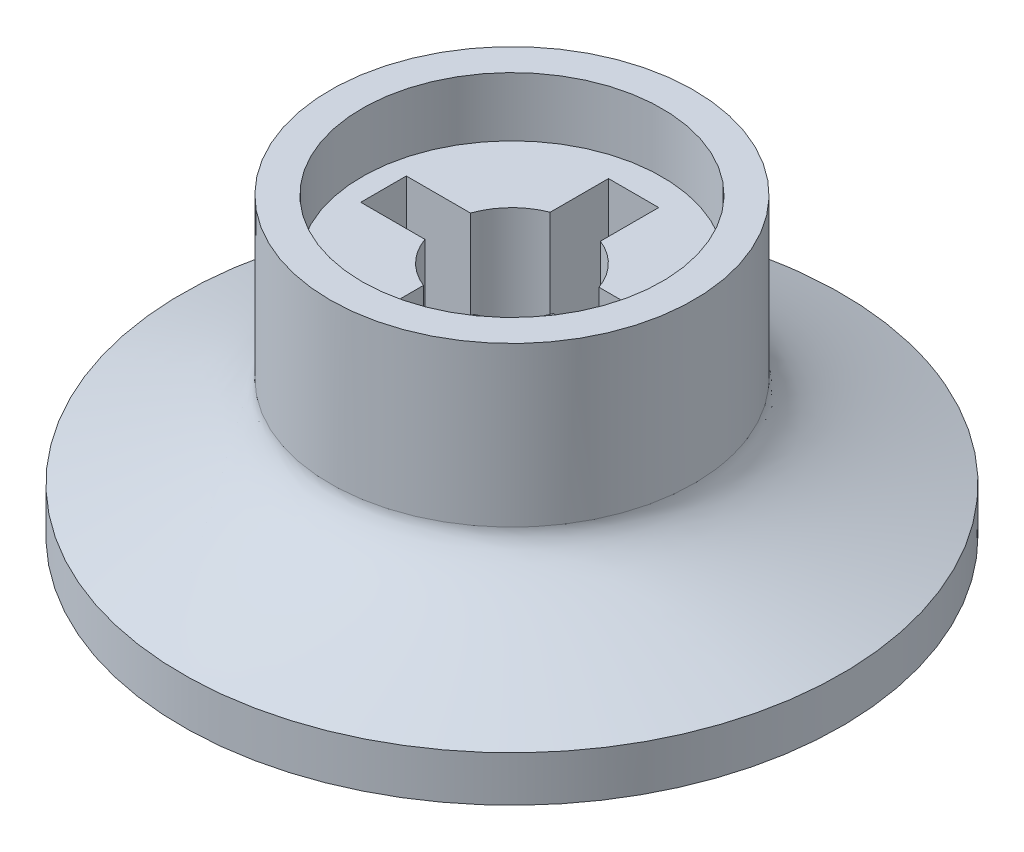
ISO-10303-21;
HEADER;
FILE_DESCRIPTION(('STEP AP214'),'2;1');
FILE_NAME('part.step','',(''),(''),'','','');
FILE_SCHEMA(('AUTOMOTIVE_DESIGN { 1 0 10303 214 1 1 1 1 }'));
ENDSEC;
DATA;
#1=APPLICATION_CONTEXT('core data for automotive mechanical design processes');
#2=APPLICATION_PROTOCOL_DEFINITION('international standard','automotive_design',2000,#1);
#3=PRODUCT_CONTEXT('',#1,'mechanical');
#4=PRODUCT('Part','Part','',(#3));
#5=PRODUCT_RELATED_PRODUCT_CATEGORY('part','',(#4));
#6=PRODUCT_DEFINITION_FORMATION('','',#4);
#7=PRODUCT_DEFINITION_CONTEXT('part definition',#1,'design');
#8=PRODUCT_DEFINITION('design','',#6,#7);
#9=PRODUCT_DEFINITION_SHAPE('','',#8);
#10=(LENGTH_UNIT() NAMED_UNIT(*) SI_UNIT(.MILLI.,.METRE.));
#11=(NAMED_UNIT(*) PLANE_ANGLE_UNIT() SI_UNIT($,.RADIAN.));
#12=(NAMED_UNIT(*) SI_UNIT($,.STERADIAN.) SOLID_ANGLE_UNIT());
#13=UNCERTAINTY_MEASURE_WITH_UNIT(LENGTH_MEASURE(1.E-05),#10,'distance_accuracy_value','');
#14=(GEOMETRIC_REPRESENTATION_CONTEXT(3) GLOBAL_UNCERTAINTY_ASSIGNED_CONTEXT((#13)) GLOBAL_UNIT_ASSIGNED_CONTEXT((#10,
#11,#12)) REPRESENTATION_CONTEXT('',''));
#15=CARTESIAN_POINT('',(0.,0.,0.));
#16=DIRECTION('',(0.,0.,1.));
#17=DIRECTION('',(1.,0.,0.));
#18=AXIS2_PLACEMENT_3D('',#15,#16,#17);
#19=CARTESIAN_POINT('',(0.,3.5,0.));
#20=DIRECTION('',(0.,-1.,0.));
#21=DIRECTION('',(0.,0.,-1.));
#22=AXIS2_PLACEMENT_3D('',#19,#20,#21);
#23=CYLINDRICAL_SURFACE('',#22,4.);
#24=CARTESIAN_POINT('',(0.,3.5,0.));
#25=DIRECTION('',(0.,1.,0.));
#26=DIRECTION('',(0.,0.,1.));
#27=AXIS2_PLACEMENT_3D('',#24,#25,#26);
#28=CIRCLE('',#27,4.);
#29=CARTESIAN_POINT('',(0.,3.5,4.));
#30=VERTEX_POINT('',#29);
#31=EDGE_CURVE('E47',#30,#30,#28,.T.);
#32=ORIENTED_EDGE('',*,*,#31,.F.);
#33=EDGE_LOOP('',(#32));
#34=FACE_BOUND('',#33,.T.);
#35=CARTESIAN_POINT('',(0.,0.,0.));
#36=DIRECTION('',(0.,1.,0.));
#37=DIRECTION('',(0.,0.,1.));
#38=AXIS2_PLACEMENT_3D('',#35,#36,#37);
#39=CIRCLE('',#38,4.);
#40=CARTESIAN_POINT('',(-3.41841549567665,0.,2.07712192682996));
#41=VERTEX_POINT('',#40);
#42=EDGE_CURVE('E199',#41,#41,#39,.T.);
#43=ORIENTED_EDGE('',*,*,#42,.T.);
#44=EDGE_LOOP('',(#43));
#45=FACE_BOUND('',#44,.T.);
#46=ADVANCED_FACE('F40',(#34,#45),#23,.T.);
#47=CARTESIAN_POINT('',(0.,3.5,0.));
#48=DIRECTION('',(0.,1.,0.));
#49=DIRECTION('',(0.,0.,1.));
#50=AXIS2_PLACEMENT_3D('',#47,#48,#49);
#51=PLANE('',#50);
#52=CARTESIAN_POINT('',(0.,3.5,0.));
#53=DIRECTION('',(0.,1.,0.));
#54=DIRECTION('',(0.,0.,1.));
#55=AXIS2_PLACEMENT_3D('',#52,#53,#54);
#56=CIRCLE('',#55,3.3);
#57=CARTESIAN_POINT('',(0.,3.5,3.3));
#58=VERTEX_POINT('',#57);
#59=EDGE_CURVE('E246',#58,#58,#56,.T.);
#60=ORIENTED_EDGE('',*,*,#59,.F.);
#61=EDGE_LOOP('',(#60));
#62=FACE_BOUND('',#61,.T.);
#63=ORIENTED_EDGE('',*,*,#31,.T.);
#64=EDGE_LOOP('',(#63));
#65=FACE_BOUND('',#64,.T.);
#66=ADVANCED_FACE('F235',(#62,#65),#51,.T.);
#67=CARTESIAN_POINT('',(0.,2.2,0.));
#68=DIRECTION('',(0.,1.,0.));
#69=DIRECTION('',(0.,0.,1.));
#70=AXIS2_PLACEMENT_3D('',#67,#68,#69);
#71=CYLINDRICAL_SURFACE('',#70,3.3);
#72=CARTESIAN_POINT('',(0.,2.2,0.));
#73=DIRECTION('',(0.,1.,0.));
#74=DIRECTION('',(0.,0.,1.));
#75=AXIS2_PLACEMENT_3D('',#72,#73,#74);
#76=CIRCLE('',#75,3.3);
#77=CARTESIAN_POINT('',(0.,2.2,3.3));
#78=VERTEX_POINT('',#77);
#79=EDGE_CURVE('E249',#78,#78,#76,.T.);
#80=ORIENTED_EDGE('',*,*,#79,.F.);
#81=EDGE_LOOP('',(#80));
#82=FACE_BOUND('',#81,.T.);
#83=ORIENTED_EDGE('',*,*,#59,.T.);
#84=EDGE_LOOP('',(#83));
#85=FACE_BOUND('',#84,.T.);
#86=ADVANCED_FACE('F233',(#82,#85),#71,.F.);
#87=CARTESIAN_POINT('',(0.,2.2,0.));
#88=DIRECTION('',(0.,1.,0.));
#89=DIRECTION('',(0.,0.,1.));
#90=AXIS2_PLACEMENT_3D('',#87,#88,#89);
#91=PLANE('',#90);
#92=CARTESIAN_POINT('',(0.,2.2,0.));
#93=DIRECTION('',(0.,1.,0.));
#94=DIRECTION('',(0.,0.,1.));
#95=AXIS2_PLACEMENT_3D('',#92,#93,#94);
#96=CIRCLE('',#95,1.5);
#97=CARTESIAN_POINT('',(0.552263358297722,2.2,1.39463442632172));
#98=VERTEX_POINT('',#97);
#99=CARTESIAN_POINT('',(1.41380435039056,2.2,0.501155922659535));
#100=VERTEX_POINT('',#99);
#101=EDGE_CURVE('E152',#98,#100,#96,.T.);
#102=ORIENTED_EDGE('',*,*,#101,.F.);
#103=DIRECTION('',(0.,0.,-1.));
#104=VECTOR('',#103,1.);
#105=CARTESIAN_POINT('',(0.552263358297722,2.2,0.));
#106=LINE('',#105,#104);
#107=CARTESIAN_POINT('',(0.552263358297722,2.2,2.76136202651855));
#108=VERTEX_POINT('',#107);
#109=EDGE_CURVE('E167',#108,#98,#106,.T.);
#110=ORIENTED_EDGE('',*,*,#109,.F.);
#111=DIRECTION('',(1.,0.,0.));
#112=VECTOR('',#111,1.);
#113=CARTESIAN_POINT('',(0.,2.2,2.76136202651855));
#114=LINE('',#113,#112);
#115=CARTESIAN_POINT('',(-0.552263358297722,2.2,2.76136202651855));
#116=VERTEX_POINT('',#115);
#117=EDGE_CURVE('E177',#116,#108,#114,.T.);
#118=ORIENTED_EDGE('',*,*,#117,.F.);
#119=DIRECTION('',(0.,0.,1.));
#120=VECTOR('',#119,1.);
#121=CARTESIAN_POINT('',(-0.552263358297722,2.2,0.));
#122=LINE('',#121,#120);
#123=CARTESIAN_POINT('',(-0.552263358297722,2.2,1.39463442632172));
#124=VERTEX_POINT('',#123);
#125=EDGE_CURVE('E181',#124,#116,#122,.T.);
#126=ORIENTED_EDGE('',*,*,#125,.F.);
#127=CARTESIAN_POINT('',(-1.41380435039056,2.2,0.501155922659535));
#128=VERTEX_POINT('',#127);
#129=EDGE_CURVE('E173',#128,#124,#96,.T.);
#130=ORIENTED_EDGE('',*,*,#129,.F.);
#131=DIRECTION('',(1.,0.,0.));
#132=VECTOR('',#131,1.);
#133=CARTESIAN_POINT('',(0.,2.2,0.501155922659535));
#134=LINE('',#133,#132);
#135=CARTESIAN_POINT('',(-2.82555946794005,2.2,0.501155922659535));
#136=VERTEX_POINT('',#135);
#137=EDGE_CURVE('E485',#136,#128,#134,.T.);
#138=ORIENTED_EDGE('',*,*,#137,.F.);
#139=DIRECTION('',(0.,0.,1.));
#140=VECTOR('',#139,1.);
#141=CARTESIAN_POINT('',(-2.82555946794005,2.2,0.));
#142=LINE('',#141,#140);
#143=CARTESIAN_POINT('',(-2.82555946794005,2.2,-0.501155922659535));
#144=VERTEX_POINT('',#143);
#145=EDGE_CURVE('E482',#144,#136,#142,.T.);
#146=ORIENTED_EDGE('',*,*,#145,.F.);
#147=DIRECTION('',(-1.,0.,0.));
#148=VECTOR('',#147,1.);
#149=CARTESIAN_POINT('',(0.,2.2,-0.501155922659535));
#150=LINE('',#149,#148);
#151=CARTESIAN_POINT('',(-1.41380435039056,2.2,-0.501155922659535));
#152=VERTEX_POINT('',#151);
#153=EDGE_CURVE('E477',#152,#144,#150,.T.);
#154=ORIENTED_EDGE('',*,*,#153,.F.);
#155=CARTESIAN_POINT('',(-0.552263358297722,2.2,-1.39463442632172));
#156=VERTEX_POINT('',#155);
#157=EDGE_CURVE('E469',#156,#152,#96,.T.);
#158=ORIENTED_EDGE('',*,*,#157,.F.);
#159=DIRECTION('',(0.,0.,1.));
#160=VECTOR('',#159,1.);
#161=CARTESIAN_POINT('',(-0.552263358297722,2.2,0.));
#162=LINE('',#161,#160);
#163=CARTESIAN_POINT('',(-0.552263358297722,2.2,-2.67606994836456));
#164=VERTEX_POINT('',#163);
#165=EDGE_CURVE('E193',#164,#156,#162,.T.);
#166=ORIENTED_EDGE('',*,*,#165,.F.);
#167=DIRECTION('',(-1.,0.,0.));
#168=VECTOR('',#167,1.);
#169=CARTESIAN_POINT('',(0.,2.2,-2.67606994836456));
#170=LINE('',#169,#168);
#171=CARTESIAN_POINT('',(0.552263358297722,2.2,-2.67606994836456));
#172=VERTEX_POINT('',#171);
#173=EDGE_CURVE('E191',#172,#164,#170,.T.);
#174=ORIENTED_EDGE('',*,*,#173,.F.);
#175=DIRECTION('',(0.,0.,-1.));
#176=VECTOR('',#175,1.);
#177=CARTESIAN_POINT('',(0.552263358297722,2.2,0.));
#178=LINE('',#177,#176);
#179=CARTESIAN_POINT('',(0.552263358297722,2.2,-1.39463442632172));
#180=VERTEX_POINT('',#179);
#181=EDGE_CURVE('E189',#180,#172,#178,.T.);
#182=ORIENTED_EDGE('',*,*,#181,.F.);
#183=CARTESIAN_POINT('',(1.41380435039056,2.2,-0.501155922659535));
#184=VERTEX_POINT('',#183);
#185=EDGE_CURVE('E171',#184,#180,#96,.T.);
#186=ORIENTED_EDGE('',*,*,#185,.F.);
#187=DIRECTION('',(-1.,0.,0.));
#188=VECTOR('',#187,1.);
#189=CARTESIAN_POINT('',(0.,2.2,-0.501155922659535));
#190=LINE('',#189,#188);
#191=CARTESIAN_POINT('',(2.7646847157996,2.2,-0.501155922659535));
#192=VERTEX_POINT('',#191);
#193=EDGE_CURVE('E186',#192,#184,#190,.T.);
#194=ORIENTED_EDGE('',*,*,#193,.F.);
#195=DIRECTION('',(0.,0.,-1.));
#196=VECTOR('',#195,1.);
#197=CARTESIAN_POINT('',(2.7646847157996,2.2,0.));
#198=LINE('',#197,#196);
#199=CARTESIAN_POINT('',(2.7646847157996,2.2,0.501155922659535));
#200=VERTEX_POINT('',#199);
#201=EDGE_CURVE('E179',#200,#192,#198,.T.);
#202=ORIENTED_EDGE('',*,*,#201,.F.);
#203=DIRECTION('',(1.,0.,0.));
#204=VECTOR('',#203,1.);
#205=CARTESIAN_POINT('',(0.,2.2,0.501155922659535));
#206=LINE('',#205,#204);
#207=EDGE_CURVE('E169',#100,#200,#206,.T.);
#208=ORIENTED_EDGE('',*,*,#207,.F.);
#209=EDGE_LOOP('',(#102,#110,#118,#126,#130,#138,#146,#154,#158,#166,#174,#182,#186,#194,#202,#208));
#210=FACE_BOUND('',#209,.T.);
#211=ORIENTED_EDGE('',*,*,#79,.T.);
#212=EDGE_LOOP('',(#211));
#213=FACE_BOUND('',#212,.T.);
#214=ADVANCED_FACE('F164',(#210,#213),#91,.T.);
#215=CARTESIAN_POINT('',(-3.41841549567665,0.,2.07712192682996));
#216=CARTESIAN_POINT('',(-0.432497455078735,-2.,7.23708822326704));
#217=CARTESIAN_POINT('',(-7.57265934933656,0.,-4.75970906452334));
#218=CARTESIAN_POINT('',(-14.9066739016128,-2.,6.37209331310957));
#219=CARTESIAN_POINT('',(-0.735828357983266,0.,-8.91395291818325));
#220=CARTESIAN_POINT('',(-14.0416789914553,-2.,-8.10208313342451));
#221=CARTESIAN_POINT('',(3.41841549567665,0.,-2.07712192682996));
#222=CARTESIAN_POINT('',(0.432497455078736,-2.,-7.23708822326704));
#223=CARTESIAN_POINT('',(7.57265934933656,0.,4.75970906452334));
#224=CARTESIAN_POINT('',(14.9066739016128,-2.,-6.37209331310956));
#225=CARTESIAN_POINT('',(0.735828357983265,0.,8.91395291818325));
#226=CARTESIAN_POINT('',(14.0416789914553,-2.,8.10208313342451));
#227=CARTESIAN_POINT('',(-3.41841549567665,0.,2.07712192682996));
#228=CARTESIAN_POINT('',(-0.432497455078735,-2.,7.23708822326704));
#229=(BOUNDED_SURFACE() B_SPLINE_SURFACE(3,1,((#215,#216),(#217,#218),(#219,#220),(#221,#222),
(#223,#224),(#225,#226),(#227,#228)),.UNSPECIFIED.,.T.,.F.,.F.) B_SPLINE_SURFACE_WITH_KNOTS((4,
3,4),(2,2),(0.,0.5,1.),(0.,1.),
.UNSPECIFIED.) GEOMETRIC_REPRESENTATION_ITEM() RATIONAL_B_SPLINE_SURFACE(((1.,1.),
(0.333333333333333,0.333333333333333),(0.333333333333333,0.333333333333333),(1.,1.),
(0.333333333333333,0.333333333333333),(0.333333333333333,0.333333333333333),(1.,1.))) REPRESENTATION_ITEM('') SURFACE());
#230=CARTESIAN_POINT('',(0.,-2.,0.));
#231=DIRECTION('',(0.,-1.,0.));
#232=DIRECTION('',(0.,0.,-1.));
#233=AXIS2_PLACEMENT_3D('',#230,#231,#232);
#234=CIRCLE('',#233,7.25);
#235=CARTESIAN_POINT('',(-0.432497455078735,-2.,7.23708822326704));
#236=VERTEX_POINT('',#235);
#237=EDGE_CURVE('E204',#236,#236,#234,.T.);
#238=CARTESIAN_POINT('',(-3.41841549567665,0.,2.07712192682996));
#239=CARTESIAN_POINT('',(-3.38731218275375,-0.0208333333333334,2.13087157575118));
#240=CARTESIAN_POINT('',(-3.35620886983086,-0.0416666666666667,2.18462122467239));
#241=CARTESIAN_POINT('',(-3.29400224398507,-0.0833333333333333,2.29212052251483));
#242=CARTESIAN_POINT('',(-3.26289893106217,-0.104166666666667,2.34587017143605));
#243=CARTESIAN_POINT('',(-3.20069230521638,-0.145833333333333,2.45336946927849));
#244=CARTESIAN_POINT('',(-3.16958899229349,-0.166666666666667,2.50711911819971));
#245=CARTESIAN_POINT('',(-3.1073823664477,-0.208333333333333,2.61461841604215));
#246=CARTESIAN_POINT('',(-3.0762790535248,-0.229166666666667,2.66836806496337));
#247=CARTESIAN_POINT('',(-3.01407242767901,-0.270833333333333,2.77586736280581));
#248=CARTESIAN_POINT('',(-2.98296911475612,-0.291666666666667,2.82961701172703));
#249=CARTESIAN_POINT('',(-2.92076248891033,-0.333333333333333,2.93711630956947));
#250=CARTESIAN_POINT('',(-2.88965917598743,-0.354166666666667,2.99086595849069));
#251=CARTESIAN_POINT('',(-2.82745255014164,-0.395833333333333,3.09836525633313));
#252=CARTESIAN_POINT('',(-2.79634923721875,-0.416666666666667,3.15211490525435));
#253=CARTESIAN_POINT('',(-2.73414261137296,-0.458333333333333,3.25961420309679));
#254=CARTESIAN_POINT('',(-2.70303929845006,-0.479166666666667,3.31336385201801));
#255=CARTESIAN_POINT('',(-2.64083267260427,-0.520833333333333,3.42086314986045));
#256=CARTESIAN_POINT('',(-2.60972935968138,-0.541666666666667,3.47461279878167));
#257=CARTESIAN_POINT('',(-2.54752273383559,-0.583333333333333,3.5821120966241));
#258=CARTESIAN_POINT('',(-2.51641942091269,-0.604166666666667,3.63586174554532));
#259=CARTESIAN_POINT('',(-2.4542127950669,-0.645833333333333,3.74336104338776));
#260=CARTESIAN_POINT('',(-2.42310948214401,-0.666666666666667,3.79711069230898));
#261=CARTESIAN_POINT('',(-2.36090285629822,-0.708333333333333,3.90460999015142));
#262=CARTESIAN_POINT('',(-2.32979954337532,-0.729166666666667,3.95835963907264));
#263=CARTESIAN_POINT('',(-2.26759291752954,-0.770833333333333,4.06585893691508));
#264=CARTESIAN_POINT('',(-2.23648960460664,-0.791666666666667,4.1196085858363));
#265=CARTESIAN_POINT('',(-2.17428297876085,-0.833333333333333,4.22710788367874));
#266=CARTESIAN_POINT('',(-2.14317966583796,-0.854166666666667,4.28085753259996));
#267=CARTESIAN_POINT('',(-2.08097303999217,-0.895833333333333,4.3883568304424));
#268=CARTESIAN_POINT('',(-2.04986972706927,-0.916666666666667,4.44210647936362));
#269=CARTESIAN_POINT('',(-1.98766310122348,-0.958333333333333,4.54960577720606));
#270=CARTESIAN_POINT('',(-1.95655978830059,-0.979166666666667,4.60335542612728));
#271=CARTESIAN_POINT('',(-1.8943531624548,-1.02083333333333,4.71085472396972));
#272=CARTESIAN_POINT('',(-1.8632498495319,-1.04166666666667,4.76460437289094));
#273=CARTESIAN_POINT('',(-1.80104322368611,-1.08333333333333,4.87210367073337));
#274=CARTESIAN_POINT('',(-1.76993991076322,-1.10416666666667,4.92585331965459));
#275=CARTESIAN_POINT('',(-1.70773328491743,-1.14583333333333,5.03335261749703));
#276=CARTESIAN_POINT('',(-1.67662997199453,-1.16666666666667,5.08710226641825));
#277=CARTESIAN_POINT('',(-1.61442334614874,-1.20833333333333,5.19460156426069));
#278=CARTESIAN_POINT('',(-1.58332003322585,-1.22916666666667,5.24835121318191));
#279=CARTESIAN_POINT('',(-1.52111340738006,-1.27083333333333,5.35585051102435));
#280=CARTESIAN_POINT('',(-1.49001009445716,-1.29166666666667,5.40960015994557));
#281=CARTESIAN_POINT('',(-1.42780346861137,-1.33333333333333,5.51709945778801));
#282=CARTESIAN_POINT('',(-1.39670015568848,-1.35416666666667,5.57084910670923));
#283=CARTESIAN_POINT('',(-1.33449352984269,-1.39583333333333,5.67834840455167));
#284=CARTESIAN_POINT('',(-1.30339021691979,-1.41666666666667,5.73209805347289));
#285=CARTESIAN_POINT('',(-1.241183591074,-1.45833333333333,5.83959735131533));
#286=CARTESIAN_POINT('',(-1.21008027815111,-1.47916666666667,5.89334700023655));
#287=CARTESIAN_POINT('',(-1.14787365230532,-1.52083333333333,6.00084629807899));
#288=CARTESIAN_POINT('',(-1.11677033938242,-1.54166666666667,6.05459594700021));
#289=CARTESIAN_POINT('',(-1.05456371353663,-1.58333333333333,6.16209524484264));
#290=CARTESIAN_POINT('',(-1.02346040061374,-1.60416666666667,6.21584489376386));
#291=CARTESIAN_POINT('',(-0.961253774767949,-1.64583333333333,6.3233441916063));
#292=CARTESIAN_POINT('',(-0.930150461845054,-1.66666666666667,6.37709384052752));
#293=CARTESIAN_POINT('',(-0.867943835999264,-1.70833333333333,6.48459313836996));
#294=CARTESIAN_POINT('',(-0.836840523076369,-1.72916666666667,6.53834278729118));
#295=CARTESIAN_POINT('',(-0.77463389723058,-1.77083333333333,6.64584208513362));
#296=CARTESIAN_POINT('',(-0.743530584307685,-1.79166666666667,6.69959173405484));
#297=CARTESIAN_POINT('',(-0.681323958461895,-1.83333333333333,6.80709103189728));
#298=CARTESIAN_POINT('',(-0.650220645539,-1.85416666666667,6.8608406808185));
#299=CARTESIAN_POINT('',(-0.58801401969321,-1.89583333333333,6.96833997866094));
#300=CARTESIAN_POINT('',(-0.556910706770315,-1.91666666666667,7.02208962758216));
#301=CARTESIAN_POINT('',(-0.494704080924525,-1.95833333333333,7.1295889254246));
#302=CARTESIAN_POINT('',(-0.46360076800163,-1.97916666666667,7.18333857434582));
#303=CARTESIAN_POINT('',(-0.432497455078735,-2.,7.23708822326704));
#304=B_SPLINE_CURVE_WITH_KNOTS('',3,(#238,#239,#240,#241,#242,#243,#244,#245,#246,#247,#248,
#249,#250,#251,#252,#253,#254,#255,#256,#257,#258,#259,#260,#261,#262,#263,#264,#265,#266,#267,
#268,#269,#270,#271,#272,#273,#274,#275,#276,#277,#278,#279,#280,#281,#282,#283,#284,#285,#286,
#287,#288,#289,#290,#291,#292,#293,#294,#295,#296,#297,#298,#299,#300,#301,#302,#303),
.UNSPECIFIED.,.F.,.F.,(4,2,2,2,2,2,2,2,2,2,2,2,2,2,2,2,2,2,2,2,2,2,2,2,2,2,2,2,2,2,2,2,4),(0.,
0.196505006311302,0.393010012622605,0.589515018933907,0.786020025245209,0.982525031556511,
1.17903003786781,1.37553504417912,1.57204005049042,1.76854505680172,1.96505006311302,
2.16155506942433,2.35806007573563,2.55456508204693,2.75107008835823,2.94757509466953,
3.14408010098084,3.34058510729214,3.53709011360344,3.73359511991474,3.93010012622605,
4.12660513253735,4.32311013884865,4.51961514515995,4.71612015147126,4.91262515778256,
5.10913016409386,5.30563517040516,5.50214017671647,5.69864518302777,5.89515018933907,
6.09165519565037,6.28816020196167),.UNSPECIFIED.);
#305=EDGE_CURVE('BSEAM210',#41,#236,#304,.T.);
#306=ORIENTED_EDGE('',*,*,#42,.F.);
#307=ORIENTED_EDGE('',*,*,#237,.F.);
#308=ORIENTED_EDGE('',*,*,#305,.T.);
#309=ORIENTED_EDGE('',*,*,#305,.F.);
#310=EDGE_LOOP('',(#306,#308,#307,#309));
#311=FACE_BOUND('',#310,.T.);
#312=ADVANCED_FACE('F210',(#311),#229,.T.);
#313=CARTESIAN_POINT('',(0.,-3.,0.));
#314=DIRECTION('',(0.,1.,0.));
#315=DIRECTION('',(0.,0.,1.));
#316=AXIS2_PLACEMENT_3D('',#313,#314,#315);
#317=CYLINDRICAL_SURFACE('',#316,7.25);
#318=CARTESIAN_POINT('',(0.,-3.,0.));
#319=DIRECTION('',(0.,-1.,0.));
#320=DIRECTION('',(0.,0.,-1.));
#321=AXIS2_PLACEMENT_3D('',#318,#319,#320);
#322=CIRCLE('',#321,7.25);
#323=CARTESIAN_POINT('',(0.,-3.,-7.25));
#324=VERTEX_POINT('',#323);
#325=EDGE_CURVE('E196',#324,#324,#322,.T.);
#326=ORIENTED_EDGE('',*,*,#325,.F.);
#327=EDGE_LOOP('',(#326));
#328=FACE_BOUND('',#327,.T.);
#329=ORIENTED_EDGE('',*,*,#237,.T.);
#330=EDGE_LOOP('',(#329));
#331=FACE_BOUND('',#330,.T.);
#332=ADVANCED_FACE('F222',(#328,#331),#317,.T.);
#333=CARTESIAN_POINT('',(0.,-3.,0.));
#334=DIRECTION('',(0.,-1.,0.));
#335=DIRECTION('',(0.,0.,-1.));
#336=AXIS2_PLACEMENT_3D('',#333,#334,#335);
#337=PLANE('',#336);
#338=CARTESIAN_POINT('',(0.,-3.,0.));
#339=DIRECTION('',(0.,1.,0.));
#340=DIRECTION('',(0.,0.,1.));
#341=AXIS2_PLACEMENT_3D('',#338,#339,#340);
#342=CIRCLE('',#341,1.5);
#343=CARTESIAN_POINT('',(1.41380435039056,-3.,-0.501155922659535));
#344=VERTEX_POINT('',#343);
#345=CARTESIAN_POINT('',(0.552263358297722,-3.,-1.39463442632172));
#346=VERTEX_POINT('',#345);
#347=EDGE_CURVE('E54',#344,#346,#342,.T.);
#348=ORIENTED_EDGE('',*,*,#347,.T.);
#349=DIRECTION('',(0.,0.,-1.));
#350=VECTOR('',#349,1.);
#351=CARTESIAN_POINT('',(0.552263358297722,-3.,-2.67606994836456));
#352=LINE('',#351,#350);
#353=CARTESIAN_POINT('',(0.552263358297722,-3.,-2.67606994836456));
#354=VERTEX_POINT('',#353);
#355=EDGE_CURVE('E521',#346,#354,#352,.T.);
#356=ORIENTED_EDGE('',*,*,#355,.T.);
#357=DIRECTION('',(-1.,0.,0.));
#358=VECTOR('',#357,1.);
#359=CARTESIAN_POINT('',(-0.552263358297722,-3.,-2.67606994836456));
#360=LINE('',#359,#358);
#361=CARTESIAN_POINT('',(-0.552263358297722,-3.,-2.67606994836456));
#362=VERTEX_POINT('',#361);
#363=EDGE_CURVE('E518',#354,#362,#360,.T.);
#364=ORIENTED_EDGE('',*,*,#363,.T.);
#365=DIRECTION('',(0.,0.,1.));
#366=VECTOR('',#365,1.);
#367=CARTESIAN_POINT('',(-0.552263358297722,-3.,-0.501155922659535));
#368=LINE('',#367,#366);
#369=CARTESIAN_POINT('',(-0.552263358297722,-3.,-1.39463442632172));
#370=VERTEX_POINT('',#369);
#371=EDGE_CURVE('E543',#362,#370,#368,.T.);
#372=ORIENTED_EDGE('',*,*,#371,.T.);
#373=CARTESIAN_POINT('',(-1.41380435039056,-3.,-0.501155922659535));
#374=VERTEX_POINT('',#373);
#375=EDGE_CURVE('E558',#370,#374,#342,.T.);
#376=ORIENTED_EDGE('',*,*,#375,.T.);
#377=DIRECTION('',(-1.,0.,0.));
#378=VECTOR('',#377,1.);
#379=CARTESIAN_POINT('',(-2.82555946794005,-3.,-0.501155922659535));
#380=LINE('',#379,#378);
#381=CARTESIAN_POINT('',(-2.82555946794005,-3.,-0.501155922659535));
#382=VERTEX_POINT('',#381);
#383=EDGE_CURVE('E479',#374,#382,#380,.T.);
#384=ORIENTED_EDGE('',*,*,#383,.T.);
#385=DIRECTION('',(0.,0.,1.));
#386=VECTOR('',#385,1.);
#387=CARTESIAN_POINT('',(-2.82555946794005,-3.,0.501155922659535));
#388=LINE('',#387,#386);
#389=CARTESIAN_POINT('',(-2.82555946794005,-3.,0.501155922659535));
#390=VERTEX_POINT('',#389);
#391=EDGE_CURVE('E539',#382,#390,#388,.T.);
#392=ORIENTED_EDGE('',*,*,#391,.T.);
#393=DIRECTION('',(1.,0.,0.));
#394=VECTOR('',#393,1.);
#395=CARTESIAN_POINT('',(-0.552263358297722,-3.,0.501155922659535));
#396=LINE('',#395,#394);
#397=CARTESIAN_POINT('',(-1.41380435039056,-3.,0.501155922659535));
#398=VERTEX_POINT('',#397);
#399=EDGE_CURVE('E536',#390,#398,#396,.T.);
#400=ORIENTED_EDGE('',*,*,#399,.T.);
#401=CARTESIAN_POINT('',(-0.552263358297722,-3.,1.39463442632172));
#402=VERTEX_POINT('',#401);
#403=EDGE_CURVE('E170',#398,#402,#342,.T.);
#404=ORIENTED_EDGE('',*,*,#403,.T.);
#405=DIRECTION('',(0.,0.,1.));
#406=VECTOR('',#405,1.);
#407=CARTESIAN_POINT('',(-0.552263358297722,-3.,2.76136202651855));
#408=LINE('',#407,#406);
#409=CARTESIAN_POINT('',(-0.552263358297722,-3.,2.76136202651855));
#410=VERTEX_POINT('',#409);
#411=EDGE_CURVE('E534',#402,#410,#408,.T.);
#412=ORIENTED_EDGE('',*,*,#411,.T.);
#413=DIRECTION('',(1.,0.,0.));
#414=VECTOR('',#413,1.);
#415=CARTESIAN_POINT('',(0.552263358297722,-3.,2.76136202651855));
#416=LINE('',#415,#414);
#417=CARTESIAN_POINT('',(0.552263358297722,-3.,2.76136202651855));
#418=VERTEX_POINT('',#417);
#419=EDGE_CURVE('E504',#410,#418,#416,.T.);
#420=ORIENTED_EDGE('',*,*,#419,.T.);
#421=DIRECTION('',(0.,0.,-1.));
#422=VECTOR('',#421,1.);
#423=CARTESIAN_POINT('',(0.552263358297722,-3.,0.501155922659535));
#424=LINE('',#423,#422);
#425=CARTESIAN_POINT('',(0.552263358297722,-3.,1.39463442632172));
#426=VERTEX_POINT('',#425);
#427=EDGE_CURVE('E531',#418,#426,#424,.T.);
#428=ORIENTED_EDGE('',*,*,#427,.T.);
#429=CARTESIAN_POINT('',(1.41380435039056,-3.,0.501155922659535));
#430=VERTEX_POINT('',#429);
#431=EDGE_CURVE('E62',#426,#430,#342,.T.);
#432=ORIENTED_EDGE('',*,*,#431,.T.);
#433=DIRECTION('',(1.,0.,0.));
#434=VECTOR('',#433,1.);
#435=CARTESIAN_POINT('',(2.7646847157996,-3.,0.501155922659535));
#436=LINE('',#435,#434);
#437=CARTESIAN_POINT('',(2.7646847157996,-3.,0.501155922659535));
#438=VERTEX_POINT('',#437);
#439=EDGE_CURVE('E529',#430,#438,#436,.T.);
#440=ORIENTED_EDGE('',*,*,#439,.T.);
#441=DIRECTION('',(0.,0.,-1.));
#442=VECTOR('',#441,1.);
#443=CARTESIAN_POINT('',(2.7646847157996,-3.,-0.501155922659535));
#444=LINE('',#443,#442);
#445=CARTESIAN_POINT('',(2.7646847157996,-3.,-0.501155922659535));
#446=VERTEX_POINT('',#445);
#447=EDGE_CURVE('E526',#438,#446,#444,.T.);
#448=ORIENTED_EDGE('',*,*,#447,.T.);
#449=DIRECTION('',(-1.,0.,0.));
#450=VECTOR('',#449,1.);
#451=CARTESIAN_POINT('',(0.552263358297722,-3.,-0.501155922659535));
#452=LINE('',#451,#450);
#453=EDGE_CURVE('E523',#446,#344,#452,.T.);
#454=ORIENTED_EDGE('',*,*,#453,.T.);
#455=EDGE_LOOP('',(#348,#356,#364,#372,#376,#384,#392,#400,#404,#412,#420,#428,#432,#440,#448,#454));
#456=FACE_BOUND('',#455,.T.);
#457=ORIENTED_EDGE('',*,*,#325,.T.);
#458=EDGE_LOOP('',(#457));
#459=FACE_BOUND('',#458,.T.);
#460=ADVANCED_FACE('F270',(#456,#459),#337,.T.);
#461=CARTESIAN_POINT('',(-0.552263358297722,-3.,-0.501155922659535));
#462=DIRECTION('',(-1.,0.,0.));
#463=DIRECTION('',(0.,0.,1.));
#464=AXIS2_PLACEMENT_3D('',#461,#462,#463);
#465=PLANE('',#464);
#466=ORIENTED_EDGE('',*,*,#165,.T.);
#467=DIRECTION('',(0.,1.,0.));
#468=VECTOR('',#467,1.);
#469=CARTESIAN_POINT('',(-0.552263358297722,-3.,-1.39463442632172));
#470=LINE('',#469,#468);
#471=EDGE_CURVE('E472',#156,#370,#470,.F.);
#472=ORIENTED_EDGE('',*,*,#471,.T.);
#473=ORIENTED_EDGE('',*,*,#371,.F.);
#474=DIRECTION('',(0.,1.,0.));
#475=VECTOR('',#474,1.);
#476=CARTESIAN_POINT('',(-0.552263358297722,-3.,-2.67606994836456));
#477=LINE('',#476,#475);
#478=EDGE_CURVE('E483',#362,#164,#477,.T.);
#479=ORIENTED_EDGE('',*,*,#478,.T.);
#480=EDGE_LOOP('',(#466,#472,#473,#479));
#481=FACE_BOUND('',#480,.T.);
#482=ADVANCED_FACE('F275',(#481),#465,.F.);
#483=CARTESIAN_POINT('',(-0.552263358297722,-3.,-2.67606994836456));
#484=DIRECTION('',(0.,0.,-1.));
#485=DIRECTION('',(-1.,0.,0.));
#486=AXIS2_PLACEMENT_3D('',#483,#484,#485);
#487=PLANE('',#486);
#488=ORIENTED_EDGE('',*,*,#173,.T.);
#489=ORIENTED_EDGE('',*,*,#478,.F.);
#490=ORIENTED_EDGE('',*,*,#363,.F.);
#491=DIRECTION('',(0.,1.,0.));
#492=VECTOR('',#491,1.);
#493=CARTESIAN_POINT('',(0.552263358297722,-3.,-2.67606994836456));
#494=LINE('',#493,#492);
#495=EDGE_CURVE('E488',#354,#172,#494,.T.);
#496=ORIENTED_EDGE('',*,*,#495,.T.);
#497=EDGE_LOOP('',(#488,#489,#490,#496));
#498=FACE_BOUND('',#497,.T.);
#499=ADVANCED_FACE('F282',(#498),#487,.F.);
#500=CARTESIAN_POINT('',(0.552263358297722,-3.,-2.67606994836456));
#501=DIRECTION('',(1.,0.,0.));
#502=DIRECTION('',(0.,0.,-1.));
#503=AXIS2_PLACEMENT_3D('',#500,#501,#502);
#504=PLANE('',#503);
#505=ORIENTED_EDGE('',*,*,#355,.F.);
#506=DIRECTION('',(0.,1.,0.));
#507=VECTOR('',#506,1.);
#508=CARTESIAN_POINT('',(0.552263358297722,-3.,-1.39463442632172));
#509=LINE('',#508,#507);
#510=EDGE_CURVE('E547',#346,#180,#509,.T.);
#511=ORIENTED_EDGE('',*,*,#510,.T.);
#512=ORIENTED_EDGE('',*,*,#181,.T.);
#513=ORIENTED_EDGE('',*,*,#495,.F.);
#514=EDGE_LOOP('',(#505,#511,#512,#513));
#515=FACE_BOUND('',#514,.T.);
#516=ADVANCED_FACE('F320',(#515),#504,.F.);
#517=CARTESIAN_POINT('',(0.552263358297722,-3.,-0.501155922659535));
#518=DIRECTION('',(0.,0.,-1.));
#519=DIRECTION('',(-1.,0.,0.));
#520=AXIS2_PLACEMENT_3D('',#517,#518,#519);
#521=PLANE('',#520);
#522=ORIENTED_EDGE('',*,*,#193,.T.);
#523=DIRECTION('',(0.,1.,0.));
#524=VECTOR('',#523,1.);
#525=CARTESIAN_POINT('',(1.41380435039056,-3.,-0.501155922659535));
#526=LINE('',#525,#524);
#527=EDGE_CURVE('E550',#184,#344,#526,.F.);
#528=ORIENTED_EDGE('',*,*,#527,.T.);
#529=ORIENTED_EDGE('',*,*,#453,.F.);
#530=DIRECTION('',(0.,1.,0.));
#531=VECTOR('',#530,1.);
#532=CARTESIAN_POINT('',(2.7646847157996,-3.,-0.501155922659535));
#533=LINE('',#532,#531);
#534=EDGE_CURVE('E513',#446,#192,#533,.T.);
#535=ORIENTED_EDGE('',*,*,#534,.T.);
#536=EDGE_LOOP('',(#522,#528,#529,#535));
#537=FACE_BOUND('',#536,.T.);
#538=ADVANCED_FACE('F316',(#537),#521,.F.);
#539=CARTESIAN_POINT('',(2.7646847157996,-3.,-0.501155922659535));
#540=DIRECTION('',(1.,0.,0.));
#541=DIRECTION('',(0.,0.,-1.));
#542=AXIS2_PLACEMENT_3D('',#539,#540,#541);
#543=PLANE('',#542);
#544=ORIENTED_EDGE('',*,*,#201,.T.);
#545=ORIENTED_EDGE('',*,*,#534,.F.);
#546=ORIENTED_EDGE('',*,*,#447,.F.);
#547=DIRECTION('',(0.,1.,0.));
#548=VECTOR('',#547,1.);
#549=CARTESIAN_POINT('',(2.7646847157996,-3.,0.501155922659535));
#550=LINE('',#549,#548);
#551=EDGE_CURVE('E507',#438,#200,#550,.T.);
#552=ORIENTED_EDGE('',*,*,#551,.T.);
#553=EDGE_LOOP('',(#544,#545,#546,#552));
#554=FACE_BOUND('',#553,.T.);
#555=ADVANCED_FACE('F312',(#554),#543,.F.);
#556=CARTESIAN_POINT('',(2.7646847157996,-3.,0.501155922659535));
#557=DIRECTION('',(0.,0.,1.));
#558=DIRECTION('',(1.,0.,0.));
#559=AXIS2_PLACEMENT_3D('',#556,#557,#558);
#560=PLANE('',#559);
#561=ORIENTED_EDGE('',*,*,#439,.F.);
#562=DIRECTION('',(0.,1.,0.));
#563=VECTOR('',#562,1.);
#564=CARTESIAN_POINT('',(1.41380435039056,-3.,0.501155922659535));
#565=LINE('',#564,#563);
#566=EDGE_CURVE('E158',#430,#100,#565,.T.);
#567=ORIENTED_EDGE('',*,*,#566,.T.);
#568=ORIENTED_EDGE('',*,*,#207,.T.);
#569=ORIENTED_EDGE('',*,*,#551,.F.);
#570=EDGE_LOOP('',(#561,#567,#568,#569));
#571=FACE_BOUND('',#570,.T.);
#572=ADVANCED_FACE('F309',(#571),#560,.F.);
#573=CARTESIAN_POINT('',(0.552263358297722,-3.,0.501155922659535));
#574=DIRECTION('',(1.,0.,0.));
#575=DIRECTION('',(0.,0.,-1.));
#576=AXIS2_PLACEMENT_3D('',#573,#574,#575);
#577=PLANE('',#576);
#578=ORIENTED_EDGE('',*,*,#109,.T.);
#579=DIRECTION('',(0.,1.,0.));
#580=VECTOR('',#579,1.);
#581=CARTESIAN_POINT('',(0.552263358297722,-3.,1.39463442632172));
#582=LINE('',#581,#580);
#583=EDGE_CURVE('E149',#98,#426,#582,.F.);
#584=ORIENTED_EDGE('',*,*,#583,.T.);
#585=ORIENTED_EDGE('',*,*,#427,.F.);
#586=DIRECTION('',(0.,1.,0.));
#587=VECTOR('',#586,1.);
#588=CARTESIAN_POINT('',(0.552263358297722,-3.,2.76136202651855));
#589=LINE('',#588,#587);
#590=EDGE_CURVE('E176',#418,#108,#589,.T.);
#591=ORIENTED_EDGE('',*,*,#590,.T.);
#592=EDGE_LOOP('',(#578,#584,#585,#591));
#593=FACE_BOUND('',#592,.T.);
#594=ADVANCED_FACE('F175',(#593),#577,.F.);
#595=CARTESIAN_POINT('',(0.552263358297722,-3.,2.76136202651855));
#596=DIRECTION('',(0.,0.,1.));
#597=DIRECTION('',(1.,0.,0.));
#598=AXIS2_PLACEMENT_3D('',#595,#596,#597);
#599=PLANE('',#598);
#600=ORIENTED_EDGE('',*,*,#117,.T.);
#601=ORIENTED_EDGE('',*,*,#590,.F.);
#602=ORIENTED_EDGE('',*,*,#419,.F.);
#603=DIRECTION('',(0.,1.,0.));
#604=VECTOR('',#603,1.);
#605=CARTESIAN_POINT('',(-0.552263358297722,-3.,2.76136202651855));
#606=LINE('',#605,#604);
#607=EDGE_CURVE('E500',#410,#116,#606,.T.);
#608=ORIENTED_EDGE('',*,*,#607,.T.);
#609=EDGE_LOOP('',(#600,#601,#602,#608));
#610=FACE_BOUND('',#609,.T.);
#611=ADVANCED_FACE('F302',(#610),#599,.F.);
#612=CARTESIAN_POINT('',(-0.552263358297722,-3.,2.76136202651855));
#613=DIRECTION('',(-1.,0.,0.));
#614=DIRECTION('',(0.,0.,1.));
#615=AXIS2_PLACEMENT_3D('',#612,#613,#614);
#616=PLANE('',#615);
#617=ORIENTED_EDGE('',*,*,#411,.F.);
#618=DIRECTION('',(0.,1.,0.));
#619=VECTOR('',#618,1.);
#620=CARTESIAN_POINT('',(-0.552263358297722,-3.,1.39463442632172));
#621=LINE('',#620,#619);
#622=EDGE_CURVE('E159',#402,#124,#621,.T.);
#623=ORIENTED_EDGE('',*,*,#622,.T.);
#624=ORIENTED_EDGE('',*,*,#125,.T.);
#625=ORIENTED_EDGE('',*,*,#607,.F.);
#626=EDGE_LOOP('',(#617,#623,#624,#625));
#627=FACE_BOUND('',#626,.T.);
#628=ADVANCED_FACE('F298',(#627),#616,.F.);
#629=CARTESIAN_POINT('',(-0.552263358297722,-3.,0.501155922659535));
#630=DIRECTION('',(0.,0.,1.));
#631=DIRECTION('',(1.,0.,0.));
#632=AXIS2_PLACEMENT_3D('',#629,#630,#631);
#633=PLANE('',#632);
#634=ORIENTED_EDGE('',*,*,#137,.T.);
#635=DIRECTION('',(0.,1.,0.));
#636=VECTOR('',#635,1.);
#637=CARTESIAN_POINT('',(-1.41380435039056,-3.,0.501155922659535));
#638=LINE('',#637,#636);
#639=EDGE_CURVE('E554',#128,#398,#638,.F.);
#640=ORIENTED_EDGE('',*,*,#639,.T.);
#641=ORIENTED_EDGE('',*,*,#399,.F.);
#642=DIRECTION('',(0.,1.,0.));
#643=VECTOR('',#642,1.);
#644=CARTESIAN_POINT('',(-2.82555946794005,-3.,0.501155922659535));
#645=LINE('',#644,#643);
#646=EDGE_CURVE('E505',#390,#136,#645,.T.);
#647=ORIENTED_EDGE('',*,*,#646,.T.);
#648=EDGE_LOOP('',(#634,#640,#641,#647));
#649=FACE_BOUND('',#648,.T.);
#650=ADVANCED_FACE('F294',(#649),#633,.F.);
#651=CARTESIAN_POINT('',(-2.82555946794005,-3.,0.501155922659535));
#652=DIRECTION('',(-1.,0.,0.));
#653=DIRECTION('',(0.,0.,1.));
#654=AXIS2_PLACEMENT_3D('',#651,#652,#653);
#655=PLANE('',#654);
#656=ORIENTED_EDGE('',*,*,#145,.T.);
#657=ORIENTED_EDGE('',*,*,#646,.F.);
#658=ORIENTED_EDGE('',*,*,#391,.F.);
#659=DIRECTION('',(0.,1.,0.));
#660=VECTOR('',#659,1.);
#661=CARTESIAN_POINT('',(-2.82555946794005,-3.,-0.501155922659535));
#662=LINE('',#661,#660);
#663=EDGE_CURVE('E491',#382,#144,#662,.T.);
#664=ORIENTED_EDGE('',*,*,#663,.T.);
#665=EDGE_LOOP('',(#656,#657,#658,#664));
#666=FACE_BOUND('',#665,.T.);
#667=ADVANCED_FACE('F290',(#666),#655,.F.);
#668=CARTESIAN_POINT('',(-2.82555946794005,-3.,-0.501155922659535));
#669=DIRECTION('',(0.,0.,-1.));
#670=DIRECTION('',(-1.,0.,0.));
#671=AXIS2_PLACEMENT_3D('',#668,#669,#670);
#672=PLANE('',#671);
#673=ORIENTED_EDGE('',*,*,#383,.F.);
#674=DIRECTION('',(0.,1.,0.));
#675=VECTOR('',#674,1.);
#676=CARTESIAN_POINT('',(-1.41380435039056,-3.,-0.501155922659535));
#677=LINE('',#676,#675);
#678=EDGE_CURVE('E12',#374,#152,#677,.T.);
#679=ORIENTED_EDGE('',*,*,#678,.T.);
#680=ORIENTED_EDGE('',*,*,#153,.T.);
#681=ORIENTED_EDGE('',*,*,#663,.F.);
#682=EDGE_LOOP('',(#673,#679,#680,#681));
#683=FACE_BOUND('',#682,.T.);
#684=ADVANCED_FACE('F286',(#683),#672,.F.);
#685=CARTESIAN_POINT('',(0.,-3.,0.));
#686=DIRECTION('',(0.,1.,0.));
#687=DIRECTION('',(0.,0.,1.));
#688=AXIS2_PLACEMENT_3D('',#685,#686,#687);
#689=CYLINDRICAL_SURFACE('',#688,1.5);
#690=ORIENTED_EDGE('',*,*,#157,.T.);
#691=ORIENTED_EDGE('',*,*,#678,.F.);
#692=ORIENTED_EDGE('',*,*,#375,.F.);
#693=ORIENTED_EDGE('',*,*,#471,.F.);
#694=EDGE_LOOP('',(#690,#691,#692,#693));
#695=FACE_BOUND('',#694,.T.);
#696=ADVANCED_FACE('F289',(#695),#689,.F.);
#697=ORIENTED_EDGE('',*,*,#403,.F.);
#698=ORIENTED_EDGE('',*,*,#639,.F.);
#699=ORIENTED_EDGE('',*,*,#129,.T.);
#700=ORIENTED_EDGE('',*,*,#622,.F.);
#701=EDGE_LOOP('',(#697,#698,#699,#700));
#702=FACE_BOUND('',#701,.T.);
#703=ADVANCED_FACE('F329',(#702),#689,.F.);
#704=ORIENTED_EDGE('',*,*,#431,.F.);
#705=ORIENTED_EDGE('',*,*,#583,.F.);
#706=ORIENTED_EDGE('',*,*,#101,.T.);
#707=ORIENTED_EDGE('',*,*,#566,.F.);
#708=EDGE_LOOP('',(#704,#705,#706,#707));
#709=FACE_BOUND('',#708,.T.);
#710=ADVANCED_FACE('F151',(#709),#689,.F.);
#711=ORIENTED_EDGE('',*,*,#347,.F.);
#712=ORIENTED_EDGE('',*,*,#527,.F.);
#713=ORIENTED_EDGE('',*,*,#185,.T.);
#714=ORIENTED_EDGE('',*,*,#510,.F.);
#715=EDGE_LOOP('',(#711,#712,#713,#714));
#716=FACE_BOUND('',#715,.T.);
#717=ADVANCED_FACE('F331',(#716),#689,.F.);
#718=CLOSED_SHELL('',(#46,#66,#86,#214,#312,#332,#460,#482,#499,#516,#538,#555,#572,#594,#611,
#628,#650,#667,#684,#696,#703,#710,#717));
#719=MANIFOLD_SOLID_BREP('B2',#718);
#720=ADVANCED_BREP_SHAPE_REPRESENTATION('',(#18,#719),#14);
#721=SHAPE_DEFINITION_REPRESENTATION(#9,#720);
ENDSEC;
END-ISO-10303-21;
